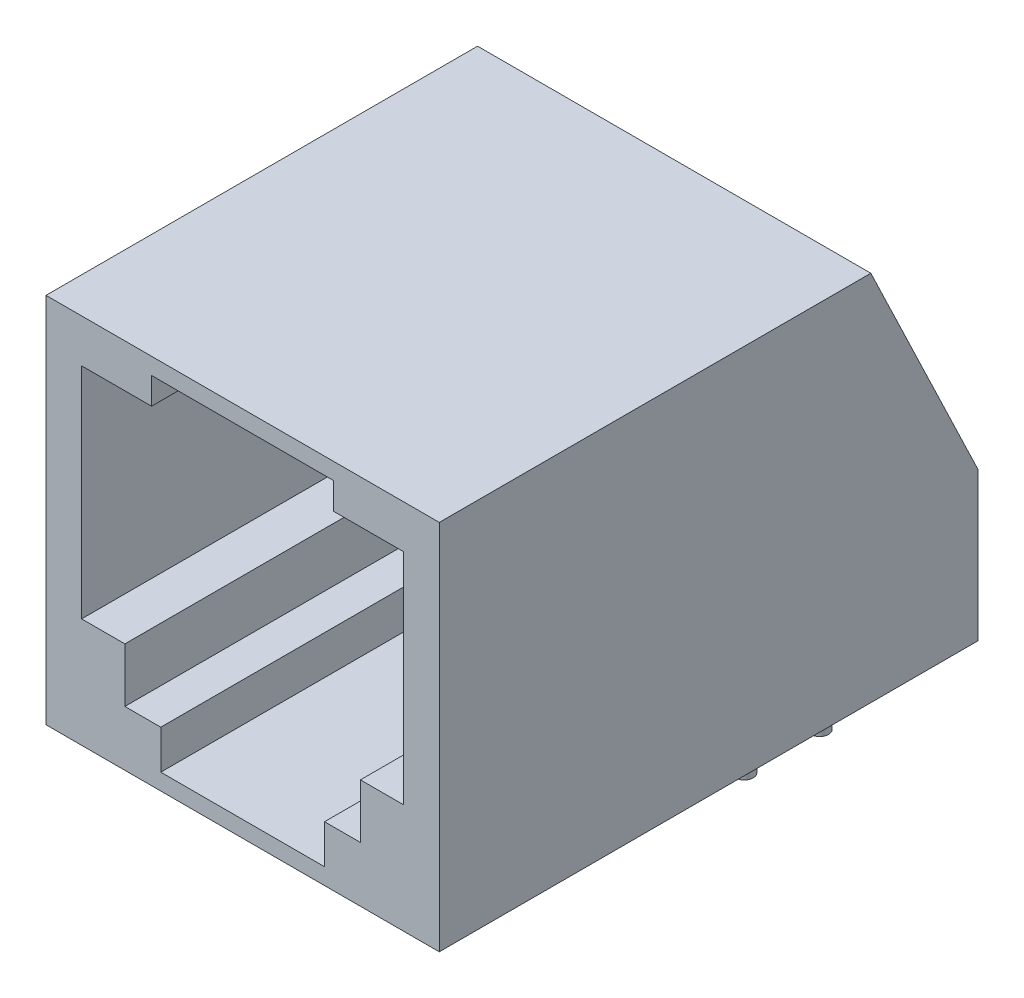
ISO-10303-21;
HEADER;
FILE_DESCRIPTION(('STEP AP214'),'2;1');
FILE_NAME('part.step','',(''),(''),'','','');
FILE_SCHEMA(('AUTOMOTIVE_DESIGN { 1 0 10303 214 1 1 1 1 }'));
ENDSEC;
DATA;
#1=APPLICATION_CONTEXT('core data for automotive mechanical design processes');
#2=APPLICATION_PROTOCOL_DEFINITION('international standard','automotive_design',2000,#1);
#3=PRODUCT_CONTEXT('',#1,'mechanical');
#4=PRODUCT('Part','Part','',(#3));
#5=PRODUCT_RELATED_PRODUCT_CATEGORY('part','',(#4));
#6=PRODUCT_DEFINITION_FORMATION('','',#4);
#7=PRODUCT_DEFINITION_CONTEXT('part definition',#1,'design');
#8=PRODUCT_DEFINITION('design','',#6,#7);
#9=PRODUCT_DEFINITION_SHAPE('','',#8);
#10=(LENGTH_UNIT() NAMED_UNIT(*) SI_UNIT(.MILLI.,.METRE.));
#11=(NAMED_UNIT(*) PLANE_ANGLE_UNIT() SI_UNIT($,.RADIAN.));
#12=(NAMED_UNIT(*) SI_UNIT($,.STERADIAN.) SOLID_ANGLE_UNIT());
#13=UNCERTAINTY_MEASURE_WITH_UNIT(LENGTH_MEASURE(1.E-05),#10,'distance_accuracy_value','');
#14=(GEOMETRIC_REPRESENTATION_CONTEXT(3) GLOBAL_UNCERTAINTY_ASSIGNED_CONTEXT((#13)) GLOBAL_UNIT_ASSIGNED_CONTEXT((#10,
#11,#12)) REPRESENTATION_CONTEXT('',''));
#15=CARTESIAN_POINT('',(0.,0.,0.));
#16=DIRECTION('',(0.,0.,1.));
#17=DIRECTION('',(1.,0.,0.));
#18=AXIS2_PLACEMENT_3D('',#15,#16,#17);
#19=CARTESIAN_POINT('',(6.625,0.,0.));
#20=DIRECTION('',(0.,0.,1.));
#21=DIRECTION('',(1.,0.,0.));
#22=AXIS2_PLACEMENT_3D('',#19,#20,#21);
#23=PLANE('',#22);
#24=DIRECTION('',(0.,-1.,0.));
#25=VECTOR('',#24,1.);
#26=CARTESIAN_POINT('',(-3.06931599732962,11.97,0.));
#27=LINE('',#26,#25);
#28=CARTESIAN_POINT('',(-3.06931599732962,11.97,0.));
#29=VERTEX_POINT('',#28);
#30=CARTESIAN_POINT('',(-3.06931599732962,11.0732094920769,0.));
#31=VERTEX_POINT('',#30);
#32=EDGE_CURVE('E48',#29,#31,#27,.T.);
#33=ORIENTED_EDGE('',*,*,#32,.F.);
#34=DIRECTION('',(1.,0.,0.));
#35=VECTOR('',#34,1.);
#36=CARTESIAN_POINT('',(-3.06931599732962,11.97,0.));
#37=LINE('',#36,#35);
#38=CARTESIAN_POINT('',(3.06931599732962,11.97,0.));
#39=VERTEX_POINT('',#38);
#40=EDGE_CURVE('E320',#29,#39,#37,.T.);
#41=ORIENTED_EDGE('',*,*,#40,.T.);
#42=DIRECTION('',(0.,-1.,0.));
#43=VECTOR('',#42,1.);
#44=CARTESIAN_POINT('',(3.06931599732962,11.97,0.));
#45=LINE('',#44,#43);
#46=CARTESIAN_POINT('',(3.06931599732962,11.0732094920769,0.));
#47=VERTEX_POINT('',#46);
#48=EDGE_CURVE('E406',#39,#47,#45,.T.);
#49=ORIENTED_EDGE('',*,*,#48,.T.);
#50=DIRECTION('',(1.,0.,0.));
#51=VECTOR('',#50,1.);
#52=CARTESIAN_POINT('',(3.06931599732962,11.0732094920769,0.));
#53=LINE('',#52,#51);
#54=CARTESIAN_POINT('',(5.425,11.0732094920769,0.));
#55=VERTEX_POINT('',#54);
#56=EDGE_CURVE('E403',#47,#55,#53,.T.);
#57=ORIENTED_EDGE('',*,*,#56,.T.);
#58=DIRECTION('',(0.,-1.,0.));
#59=VECTOR('',#58,1.);
#60=CARTESIAN_POINT('',(5.425,11.0732094920769,0.));
#61=LINE('',#60,#59);
#62=CARTESIAN_POINT('',(5.425,3.68924953145161,0.));
#63=VERTEX_POINT('',#62);
#64=EDGE_CURVE('E400',#55,#63,#61,.T.);
#65=ORIENTED_EDGE('',*,*,#64,.T.);
#66=DIRECTION('',(-1.,0.,0.));
#67=VECTOR('',#66,1.);
#68=CARTESIAN_POINT('',(5.425,3.68924953145161,0.));
#69=LINE('',#68,#67);
#70=CARTESIAN_POINT('',(3.96769772212622,3.68924953145161,0.));
#71=VERTEX_POINT('',#70);
#72=EDGE_CURVE('E397',#63,#71,#69,.T.);
#73=ORIENTED_EDGE('',*,*,#72,.T.);
#74=DIRECTION('',(0.,-1.,0.));
#75=VECTOR('',#74,1.);
#76=CARTESIAN_POINT('',(3.96769772212622,3.68924953145161,0.));
#77=LINE('',#76,#75);
#78=CARTESIAN_POINT('',(3.96769772212622,1.86326847670819,0.));
#79=VERTEX_POINT('',#78);
#80=EDGE_CURVE('E394',#71,#79,#77,.T.);
#81=ORIENTED_EDGE('',*,*,#80,.T.);
#82=DIRECTION('',(-1.,0.,0.));
#83=VECTOR('',#82,1.);
#84=CARTESIAN_POINT('',(3.96769772212622,1.86326847670819,0.));
#85=LINE('',#84,#83);
#86=CARTESIAN_POINT('',(2.75841266184855,1.86326847670819,0.));
#87=VERTEX_POINT('',#86);
#88=EDGE_CURVE('E391',#79,#87,#85,.T.);
#89=ORIENTED_EDGE('',*,*,#88,.T.);
#90=DIRECTION('',(0.,-1.,0.));
#91=VECTOR('',#90,1.);
#92=CARTESIAN_POINT('',(2.75841266184855,1.86326847670819,0.));
#93=LINE('',#92,#91);
#94=CARTESIAN_POINT('',(2.75841266184855,0.55,0.));
#95=VERTEX_POINT('',#94);
#96=EDGE_CURVE('E388',#87,#95,#93,.T.);
#97=ORIENTED_EDGE('',*,*,#96,.T.);
#98=DIRECTION('',(-1.,0.,0.));
#99=VECTOR('',#98,1.);
#100=CARTESIAN_POINT('',(2.75841266184855,0.55,0.));
#101=LINE('',#100,#99);
#102=CARTESIAN_POINT('',(-2.75841266184855,0.55,0.));
#103=VERTEX_POINT('',#102);
#104=EDGE_CURVE('E385',#95,#103,#101,.T.);
#105=ORIENTED_EDGE('',*,*,#104,.T.);
#106=DIRECTION('',(0.,-1.,0.));
#107=VECTOR('',#106,1.);
#108=CARTESIAN_POINT('',(-2.75841266184855,1.86326847670819,0.));
#109=LINE('',#108,#107);
#110=CARTESIAN_POINT('',(-2.75841266184855,1.86326847670819,0.));
#111=VERTEX_POINT('',#110);
#112=EDGE_CURVE('E382',#111,#103,#109,.T.);
#113=ORIENTED_EDGE('',*,*,#112,.F.);
#114=DIRECTION('',(1.,0.,0.));
#115=VECTOR('',#114,1.);
#116=CARTESIAN_POINT('',(-3.96769772212622,1.86326847670819,0.));
#117=LINE('',#116,#115);
#118=CARTESIAN_POINT('',(-3.96769772212622,1.86326847670819,0.));
#119=VERTEX_POINT('',#118);
#120=EDGE_CURVE('E379',#119,#111,#117,.T.);
#121=ORIENTED_EDGE('',*,*,#120,.F.);
#122=DIRECTION('',(0.,-1.,0.));
#123=VECTOR('',#122,1.);
#124=CARTESIAN_POINT('',(-3.96769772212622,3.68924953145161,0.));
#125=LINE('',#124,#123);
#126=CARTESIAN_POINT('',(-3.96769772212622,3.68924953145161,0.));
#127=VERTEX_POINT('',#126);
#128=EDGE_CURVE('E376',#127,#119,#125,.T.);
#129=ORIENTED_EDGE('',*,*,#128,.F.);
#130=DIRECTION('',(1.,0.,0.));
#131=VECTOR('',#130,1.);
#132=CARTESIAN_POINT('',(-5.425,3.68924953145161,0.));
#133=LINE('',#132,#131);
#134=CARTESIAN_POINT('',(-5.425,3.68924953145161,0.));
#135=VERTEX_POINT('',#134);
#136=EDGE_CURVE('E373',#135,#127,#133,.T.);
#137=ORIENTED_EDGE('',*,*,#136,.F.);
#138=DIRECTION('',(0.,-1.,0.));
#139=VECTOR('',#138,1.);
#140=CARTESIAN_POINT('',(-5.425,11.0732094920769,0.));
#141=LINE('',#140,#139);
#142=CARTESIAN_POINT('',(-5.425,11.0732094920769,0.));
#143=VERTEX_POINT('',#142);
#144=EDGE_CURVE('E370',#143,#135,#141,.T.);
#145=ORIENTED_EDGE('',*,*,#144,.F.);
#146=DIRECTION('',(-1.,0.,0.));
#147=VECTOR('',#146,1.);
#148=CARTESIAN_POINT('',(-3.06931599732962,11.0732094920769,0.));
#149=LINE('',#148,#147);
#150=EDGE_CURVE('E367',#31,#143,#149,.T.);
#151=ORIENTED_EDGE('',*,*,#150,.F.);
#152=EDGE_LOOP('',(#33,#41,#49,#57,#65,#73,#81,#89,#97,#105,#113,#121,#129,#137,#145,#151));
#153=FACE_BOUND('',#152,.T.);
#154=DIRECTION('',(0.,1.,0.));
#155=VECTOR('',#154,1.);
#156=CARTESIAN_POINT('',(-6.625,0.,0.));
#157=LINE('',#156,#155);
#158=CARTESIAN_POINT('',(-6.625,0.,0.));
#159=VERTEX_POINT('',#158);
#160=CARTESIAN_POINT('',(-6.625,12.53,0.));
#161=VERTEX_POINT('',#160);
#162=EDGE_CURVE('E122',#159,#161,#157,.T.);
#163=ORIENTED_EDGE('',*,*,#162,.F.);
#164=DIRECTION('',(-1.,0.,0.));
#165=VECTOR('',#164,1.);
#166=CARTESIAN_POINT('',(6.625,0.,0.));
#167=LINE('',#166,#165);
#168=CARTESIAN_POINT('',(6.625,0.,0.));
#169=VERTEX_POINT('',#168);
#170=EDGE_CURVE('E11',#169,#159,#167,.T.);
#171=ORIENTED_EDGE('',*,*,#170,.F.);
#172=DIRECTION('',(0.,1.,0.));
#173=VECTOR('',#172,1.);
#174=CARTESIAN_POINT('',(6.625,0.,0.));
#175=LINE('',#174,#173);
#176=CARTESIAN_POINT('',(6.625,12.53,0.));
#177=VERTEX_POINT('',#176);
#178=EDGE_CURVE('E117',#169,#177,#175,.T.);
#179=ORIENTED_EDGE('',*,*,#178,.T.);
#180=DIRECTION('',(-1.,0.,0.));
#181=VECTOR('',#180,1.);
#182=CARTESIAN_POINT('',(6.625,12.53,0.));
#183=LINE('',#182,#181);
#184=EDGE_CURVE('E35',#177,#161,#183,.T.);
#185=ORIENTED_EDGE('',*,*,#184,.T.);
#186=EDGE_LOOP('',(#163,#171,#179,#185));
#187=FACE_BOUND('',#186,.T.);
#188=ADVANCED_FACE('F32',(#153,#187),#23,.T.);
#189=CARTESIAN_POINT('',(6.625,0.,-18.15));
#190=DIRECTION('',(0.,-1.,0.));
#191=DIRECTION('',(0.,0.,-1.));
#192=AXIS2_PLACEMENT_3D('',#189,#190,#191);
#193=PLANE('',#192);
#194=CARTESIAN_POINT('',(2.54,0.,-14.36));
#195=DIRECTION('',(0.,-1.,0.));
#196=DIRECTION('',(0.,0.,-1.));
#197=AXIS2_PLACEMENT_3D('',#194,#195,#196);
#198=CIRCLE('',#197,0.3);
#199=CARTESIAN_POINT('',(2.54,0.,-14.66));
#200=VERTEX_POINT('',#199);
#201=EDGE_CURVE('E282',#200,#200,#198,.T.);
#202=ORIENTED_EDGE('',*,*,#201,.F.);
#203=EDGE_LOOP('',(#202));
#204=FACE_BOUND('',#203,.T.);
#205=CARTESIAN_POINT('',(-2.54,0.,-14.36));
#206=DIRECTION('',(0.,-1.,0.));
#207=DIRECTION('',(0.,0.,-1.));
#208=AXIS2_PLACEMENT_3D('',#205,#206,#207);
#209=CIRCLE('',#208,0.3);
#210=CARTESIAN_POINT('',(-2.54,0.,-14.66));
#211=VERTEX_POINT('',#210);
#212=EDGE_CURVE('E281',#211,#211,#209,.T.);
#213=ORIENTED_EDGE('',*,*,#212,.F.);
#214=EDGE_LOOP('',(#213));
#215=FACE_BOUND('',#214,.T.);
#216=CARTESIAN_POINT('',(0.,0.,-14.3600000000001));
#217=DIRECTION('',(0.,-1.,0.));
#218=DIRECTION('',(0.,0.,-1.));
#219=AXIS2_PLACEMENT_3D('',#216,#217,#218);
#220=CIRCLE('',#219,0.3);
#221=CARTESIAN_POINT('',(0.,0.,-14.6600000000001));
#222=VERTEX_POINT('',#221);
#223=EDGE_CURVE('E291',#222,#222,#220,.T.);
#224=ORIENTED_EDGE('',*,*,#223,.F.);
#225=EDGE_LOOP('',(#224));
#226=FACE_BOUND('',#225,.T.);
#227=CARTESIAN_POINT('',(-2.54,0.,-16.9));
#228=DIRECTION('',(0.,-1.,0.));
#229=DIRECTION('',(0.,0.,-1.));
#230=AXIS2_PLACEMENT_3D('',#227,#228,#229);
#231=CIRCLE('',#230,0.300000000000002);
#232=CARTESIAN_POINT('',(-2.54,0.,-17.2));
#233=VERTEX_POINT('',#232);
#234=EDGE_CURVE('E296',#233,#233,#231,.T.);
#235=ORIENTED_EDGE('',*,*,#234,.F.);
#236=EDGE_LOOP('',(#235));
#237=FACE_BOUND('',#236,.T.);
#238=CARTESIAN_POINT('',(0.,0.,-16.9));
#239=DIRECTION('',(0.,-1.,0.));
#240=DIRECTION('',(0.,0.,-1.));
#241=AXIS2_PLACEMENT_3D('',#238,#239,#240);
#242=CIRCLE('',#241,0.3);
#243=CARTESIAN_POINT('',(0.,0.,-17.2));
#244=VERTEX_POINT('',#243);
#245=EDGE_CURVE('E302',#244,#244,#242,.T.);
#246=ORIENTED_EDGE('',*,*,#245,.F.);
#247=EDGE_LOOP('',(#246));
#248=FACE_BOUND('',#247,.T.);
#249=CARTESIAN_POINT('',(2.54,0.,-16.9));
#250=DIRECTION('',(0.,-1.,0.));
#251=DIRECTION('',(0.,0.,-1.));
#252=AXIS2_PLACEMENT_3D('',#249,#250,#251);
#253=CIRCLE('',#252,0.300000000000002);
#254=CARTESIAN_POINT('',(2.54,0.,-17.2));
#255=VERTEX_POINT('',#254);
#256=EDGE_CURVE('E308',#255,#255,#253,.T.);
#257=ORIENTED_EDGE('',*,*,#256,.F.);
#258=EDGE_LOOP('',(#257));
#259=FACE_BOUND('',#258,.T.);
#260=DIRECTION('',(0.,0.,1.));
#261=VECTOR('',#260,1.);
#262=CARTESIAN_POINT('',(-6.625,0.,-18.15));
#263=LINE('',#262,#261);
#264=CARTESIAN_POINT('',(-6.625,0.,-18.15));
#265=VERTEX_POINT('',#264);
#266=EDGE_CURVE('E132',#265,#159,#263,.T.);
#267=ORIENTED_EDGE('',*,*,#266,.F.);
#268=DIRECTION('',(-1.,0.,0.));
#269=VECTOR('',#268,1.);
#270=CARTESIAN_POINT('',(6.625,0.,-18.15));
#271=LINE('',#270,#269);
#272=CARTESIAN_POINT('',(6.625,0.,-18.15));
#273=VERTEX_POINT('',#272);
#274=EDGE_CURVE('E40',#273,#265,#271,.T.);
#275=ORIENTED_EDGE('',*,*,#274,.F.);
#276=DIRECTION('',(0.,0.,1.));
#277=VECTOR('',#276,1.);
#278=CARTESIAN_POINT('',(6.625,0.,-18.15));
#279=LINE('',#278,#277);
#280=EDGE_CURVE('E112',#273,#169,#279,.T.);
#281=ORIENTED_EDGE('',*,*,#280,.T.);
#282=ORIENTED_EDGE('',*,*,#170,.T.);
#283=EDGE_LOOP('',(#267,#275,#281,#282));
#284=FACE_BOUND('',#283,.T.);
#285=ADVANCED_FACE('F138',(#204,#215,#226,#237,#248,#259,#284),#193,.T.);
#286=CARTESIAN_POINT('',(6.625,5.,-18.15));
#287=DIRECTION('',(0.,0.,-1.));
#288=DIRECTION('',(-1.,0.,0.));
#289=AXIS2_PLACEMENT_3D('',#286,#287,#288);
#290=PLANE('',#289);
#291=DIRECTION('',(0.,-1.,0.));
#292=VECTOR('',#291,1.);
#293=CARTESIAN_POINT('',(-6.625,5.,-18.15));
#294=LINE('',#293,#292);
#295=CARTESIAN_POINT('',(-6.625,5.,-18.15));
#296=VERTEX_POINT('',#295);
#297=EDGE_CURVE('E101',#296,#265,#294,.T.);
#298=ORIENTED_EDGE('',*,*,#297,.F.);
#299=DIRECTION('',(-1.,0.,0.));
#300=VECTOR('',#299,1.);
#301=CARTESIAN_POINT('',(6.625,5.,-18.15));
#302=LINE('',#301,#300);
#303=CARTESIAN_POINT('',(6.625,5.,-18.15));
#304=VERTEX_POINT('',#303);
#305=EDGE_CURVE('E95',#304,#296,#302,.T.);
#306=ORIENTED_EDGE('',*,*,#305,.F.);
#307=DIRECTION('',(0.,-1.,0.));
#308=VECTOR('',#307,1.);
#309=CARTESIAN_POINT('',(6.625,5.,-18.15));
#310=LINE('',#309,#308);
#311=EDGE_CURVE('E98',#304,#273,#310,.T.);
#312=ORIENTED_EDGE('',*,*,#311,.T.);
#313=ORIENTED_EDGE('',*,*,#274,.T.);
#314=EDGE_LOOP('',(#298,#306,#312,#313));
#315=FACE_BOUND('',#314,.T.);
#316=ADVANCED_FACE('F97',(#315),#290,.T.);
#317=CARTESIAN_POINT('',(6.625,12.53,-14.54));
#318=DIRECTION('',(0.,0.432302778813914,-0.901728510933179));
#319=DIRECTION('',(0.,0.901728510933179,0.432302778813914));
#320=AXIS2_PLACEMENT_3D('',#317,#318,#319);
#321=PLANE('',#320);
#322=DIRECTION('',(0.,-0.901728510933179,-0.432302778813914));
#323=VECTOR('',#322,1.);
#324=CARTESIAN_POINT('',(-6.625,12.53,-14.54));
#325=LINE('',#324,#323);
#326=CARTESIAN_POINT('',(-6.625,12.53,-14.54));
#327=VERTEX_POINT('',#326);
#328=EDGE_CURVE('E129',#327,#296,#325,.T.);
#329=ORIENTED_EDGE('',*,*,#328,.F.);
#330=DIRECTION('',(-1.,0.,0.));
#331=VECTOR('',#330,1.);
#332=CARTESIAN_POINT('',(6.625,12.53,-14.54));
#333=LINE('',#332,#331);
#334=CARTESIAN_POINT('',(6.625,12.53,-14.54));
#335=VERTEX_POINT('',#334);
#336=EDGE_CURVE('E106',#335,#327,#333,.T.);
#337=ORIENTED_EDGE('',*,*,#336,.F.);
#338=DIRECTION('',(0.,-0.901728510933179,-0.432302778813914));
#339=VECTOR('',#338,1.);
#340=CARTESIAN_POINT('',(6.625,12.53,-14.54));
#341=LINE('',#340,#339);
#342=EDGE_CURVE('E111',#335,#304,#341,.T.);
#343=ORIENTED_EDGE('',*,*,#342,.T.);
#344=ORIENTED_EDGE('',*,*,#305,.T.);
#345=EDGE_LOOP('',(#329,#337,#343,#344));
#346=FACE_BOUND('',#345,.T.);
#347=ADVANCED_FACE('F114',(#346),#321,.T.);
#348=CARTESIAN_POINT('',(6.625,12.53,0.));
#349=DIRECTION('',(0.,1.,0.));
#350=DIRECTION('',(0.,0.,1.));
#351=AXIS2_PLACEMENT_3D('',#348,#349,#350);
#352=PLANE('',#351);
#353=DIRECTION('',(0.,0.,-1.));
#354=VECTOR('',#353,1.);
#355=CARTESIAN_POINT('',(-6.625,12.53,0.));
#356=LINE('',#355,#354);
#357=EDGE_CURVE('E125',#161,#327,#356,.T.);
#358=ORIENTED_EDGE('',*,*,#357,.F.);
#359=ORIENTED_EDGE('',*,*,#184,.F.);
#360=DIRECTION('',(0.,0.,-1.));
#361=VECTOR('',#360,1.);
#362=CARTESIAN_POINT('',(6.625,12.53,0.));
#363=LINE('',#362,#361);
#364=EDGE_CURVE('E115',#177,#335,#363,.T.);
#365=ORIENTED_EDGE('',*,*,#364,.T.);
#366=ORIENTED_EDGE('',*,*,#336,.T.);
#367=EDGE_LOOP('',(#358,#359,#365,#366));
#368=FACE_BOUND('',#367,.T.);
#369=ADVANCED_FACE('F135',(#368),#352,.T.);
#370=CARTESIAN_POINT('',(6.625,0.,0.));
#371=DIRECTION('',(-1.,0.,0.));
#372=DIRECTION('',(0.,0.,1.));
#373=AXIS2_PLACEMENT_3D('',#370,#371,#372);
#374=PLANE('',#373);
#375=ORIENTED_EDGE('',*,*,#178,.F.);
#376=ORIENTED_EDGE('',*,*,#280,.F.);
#377=ORIENTED_EDGE('',*,*,#311,.F.);
#378=ORIENTED_EDGE('',*,*,#342,.F.);
#379=ORIENTED_EDGE('',*,*,#364,.F.);
#380=EDGE_LOOP('',(#375,#376,#377,#378,#379));
#381=FACE_BOUND('',#380,.T.);
#382=ADVANCED_FACE('F110',(#381),#374,.F.);
#383=CARTESIAN_POINT('',(-6.625,0.,0.));
#384=DIRECTION('',(-1.,0.,0.));
#385=DIRECTION('',(0.,0.,1.));
#386=AXIS2_PLACEMENT_3D('',#383,#384,#385);
#387=PLANE('',#386);
#388=ORIENTED_EDGE('',*,*,#162,.T.);
#389=ORIENTED_EDGE('',*,*,#357,.T.);
#390=ORIENTED_EDGE('',*,*,#328,.T.);
#391=ORIENTED_EDGE('',*,*,#297,.T.);
#392=ORIENTED_EDGE('',*,*,#266,.T.);
#393=EDGE_LOOP('',(#388,#389,#390,#391,#392));
#394=FACE_BOUND('',#393,.T.);
#395=ADVANCED_FACE('F137',(#394),#387,.T.);
#396=CARTESIAN_POINT('',(-3.06931599732962,11.97,-13.25));
#397=DIRECTION('',(-1.,0.,0.));
#398=DIRECTION('',(0.,0.,1.));
#399=AXIS2_PLACEMENT_3D('',#396,#397,#398);
#400=PLANE('',#399);
#401=ORIENTED_EDGE('',*,*,#32,.T.);
#402=DIRECTION('',(0.,0.,1.));
#403=VECTOR('',#402,1.);
#404=CARTESIAN_POINT('',(-3.06931599732962,11.0732094920769,-13.25));
#405=LINE('',#404,#403);
#406=CARTESIAN_POINT('',(-3.06931599732962,11.0732094920769,-13.25));
#407=VERTEX_POINT('',#406);
#408=EDGE_CURVE('E365',#407,#31,#405,.T.);
#409=ORIENTED_EDGE('',*,*,#408,.F.);
#410=DIRECTION('',(0.,-1.,0.));
#411=VECTOR('',#410,1.);
#412=CARTESIAN_POINT('',(-3.06931599732962,11.97,-13.25));
#413=LINE('',#412,#411);
#414=CARTESIAN_POINT('',(-3.06931599732962,11.97,-13.25));
#415=VERTEX_POINT('',#414);
#416=EDGE_CURVE('E316',#415,#407,#413,.T.);
#417=ORIENTED_EDGE('',*,*,#416,.F.);
#418=DIRECTION('',(0.,0.,1.));
#419=VECTOR('',#418,1.);
#420=CARTESIAN_POINT('',(-3.06931599732962,11.97,-13.25));
#421=LINE('',#420,#419);
#422=EDGE_CURVE('E126',#415,#29,#421,.T.);
#423=ORIENTED_EDGE('',*,*,#422,.T.);
#424=EDGE_LOOP('',(#401,#409,#417,#423));
#425=FACE_BOUND('',#424,.T.);
#426=ADVANCED_FACE('F161',(#425),#400,.F.);
#427=CARTESIAN_POINT('',(-3.06931599732962,11.97,-13.25));
#428=DIRECTION('',(0.,-1.,0.));
#429=DIRECTION('',(0.,0.,-1.));
#430=AXIS2_PLACEMENT_3D('',#427,#428,#429);
#431=PLANE('',#430);
#432=ORIENTED_EDGE('',*,*,#40,.F.);
#433=ORIENTED_EDGE('',*,*,#422,.F.);
#434=DIRECTION('',(1.,0.,0.));
#435=VECTOR('',#434,1.);
#436=CARTESIAN_POINT('',(-3.06931599732962,11.97,-13.25));
#437=LINE('',#436,#435);
#438=CARTESIAN_POINT('',(3.06931599732962,11.97,-13.25));
#439=VERTEX_POINT('',#438);
#440=EDGE_CURVE('E362',#415,#439,#437,.T.);
#441=ORIENTED_EDGE('',*,*,#440,.T.);
#442=DIRECTION('',(0.,0.,1.));
#443=VECTOR('',#442,1.);
#444=CARTESIAN_POINT('',(3.06931599732962,11.97,-13.25));
#445=LINE('',#444,#443);
#446=EDGE_CURVE('E412',#439,#39,#445,.T.);
#447=ORIENTED_EDGE('',*,*,#446,.T.);
#448=EDGE_LOOP('',(#432,#433,#441,#447));
#449=FACE_BOUND('',#448,.T.);
#450=ADVANCED_FACE('F165',(#449),#431,.T.);
#451=CARTESIAN_POINT('',(3.06931599732962,11.97,-13.25));
#452=DIRECTION('',(-1.,0.,0.));
#453=DIRECTION('',(0.,0.,1.));
#454=AXIS2_PLACEMENT_3D('',#451,#452,#453);
#455=PLANE('',#454);
#456=ORIENTED_EDGE('',*,*,#48,.F.);
#457=ORIENTED_EDGE('',*,*,#446,.F.);
#458=DIRECTION('',(0.,-1.,0.));
#459=VECTOR('',#458,1.);
#460=CARTESIAN_POINT('',(3.06931599732962,11.97,-13.25));
#461=LINE('',#460,#459);
#462=CARTESIAN_POINT('',(3.06931599732962,11.0732094920769,-13.25));
#463=VERTEX_POINT('',#462);
#464=EDGE_CURVE('E359',#439,#463,#461,.T.);
#465=ORIENTED_EDGE('',*,*,#464,.T.);
#466=DIRECTION('',(0.,0.,1.));
#467=VECTOR('',#466,1.);
#468=CARTESIAN_POINT('',(3.06931599732962,11.0732094920769,-13.25));
#469=LINE('',#468,#467);
#470=EDGE_CURVE('E415',#463,#47,#469,.T.);
#471=ORIENTED_EDGE('',*,*,#470,.T.);
#472=EDGE_LOOP('',(#456,#457,#465,#471));
#473=FACE_BOUND('',#472,.T.);
#474=ADVANCED_FACE('F218',(#473),#455,.T.);
#475=CARTESIAN_POINT('',(3.06931599732962,11.0732094920769,-13.25));
#476=DIRECTION('',(0.,-1.,0.));
#477=DIRECTION('',(0.,0.,-1.));
#478=AXIS2_PLACEMENT_3D('',#475,#476,#477);
#479=PLANE('',#478);
#480=ORIENTED_EDGE('',*,*,#56,.F.);
#481=ORIENTED_EDGE('',*,*,#470,.F.);
#482=DIRECTION('',(1.,0.,0.));
#483=VECTOR('',#482,1.);
#484=CARTESIAN_POINT('',(3.06931599732962,11.0732094920769,-13.25));
#485=LINE('',#484,#483);
#486=CARTESIAN_POINT('',(5.425,11.0732094920769,-13.25));
#487=VERTEX_POINT('',#486);
#488=EDGE_CURVE('E356',#463,#487,#485,.T.);
#489=ORIENTED_EDGE('',*,*,#488,.T.);
#490=DIRECTION('',(0.,0.,1.));
#491=VECTOR('',#490,1.);
#492=CARTESIAN_POINT('',(5.425,11.0732094920769,-13.25));
#493=LINE('',#492,#491);
#494=EDGE_CURVE('E418',#487,#55,#493,.T.);
#495=ORIENTED_EDGE('',*,*,#494,.T.);
#496=EDGE_LOOP('',(#480,#481,#489,#495));
#497=FACE_BOUND('',#496,.T.);
#498=ADVANCED_FACE('F214',(#497),#479,.T.);
#499=CARTESIAN_POINT('',(5.425,11.0732094920769,-13.25));
#500=DIRECTION('',(-1.,0.,0.));
#501=DIRECTION('',(0.,-1.,0.));
#502=AXIS2_PLACEMENT_3D('',#499,#500,#501);
#503=PLANE('',#502);
#504=ORIENTED_EDGE('',*,*,#64,.F.);
#505=ORIENTED_EDGE('',*,*,#494,.F.);
#506=DIRECTION('',(0.,-1.,0.));
#507=VECTOR('',#506,1.);
#508=CARTESIAN_POINT('',(5.425,11.0732094920769,-13.25));
#509=LINE('',#508,#507);
#510=CARTESIAN_POINT('',(5.425,3.68924953145161,-13.25));
#511=VERTEX_POINT('',#510);
#512=EDGE_CURVE('E353',#487,#511,#509,.T.);
#513=ORIENTED_EDGE('',*,*,#512,.T.);
#514=DIRECTION('',(0.,0.,1.));
#515=VECTOR('',#514,1.);
#516=CARTESIAN_POINT('',(5.425,3.68924953145161,-13.25));
#517=LINE('',#516,#515);
#518=EDGE_CURVE('E421',#511,#63,#517,.T.);
#519=ORIENTED_EDGE('',*,*,#518,.T.);
#520=EDGE_LOOP('',(#504,#505,#513,#519));
#521=FACE_BOUND('',#520,.T.);
#522=ADVANCED_FACE('F210',(#521),#503,.T.);
#523=CARTESIAN_POINT('',(5.425,3.68924953145161,-13.25));
#524=DIRECTION('',(0.,1.,0.));
#525=DIRECTION('',(-1.,0.,0.));
#526=AXIS2_PLACEMENT_3D('',#523,#524,#525);
#527=PLANE('',#526);
#528=ORIENTED_EDGE('',*,*,#72,.F.);
#529=ORIENTED_EDGE('',*,*,#518,.F.);
#530=DIRECTION('',(-1.,0.,0.));
#531=VECTOR('',#530,1.);
#532=CARTESIAN_POINT('',(5.425,3.68924953145161,-13.25));
#533=LINE('',#532,#531);
#534=CARTESIAN_POINT('',(3.96769772212622,3.68924953145161,-13.25));
#535=VERTEX_POINT('',#534);
#536=EDGE_CURVE('E350',#511,#535,#533,.T.);
#537=ORIENTED_EDGE('',*,*,#536,.T.);
#538=DIRECTION('',(0.,0.,1.));
#539=VECTOR('',#538,1.);
#540=CARTESIAN_POINT('',(3.96769772212622,3.68924953145161,-13.25));
#541=LINE('',#540,#539);
#542=EDGE_CURVE('E424',#535,#71,#541,.T.);
#543=ORIENTED_EDGE('',*,*,#542,.T.);
#544=EDGE_LOOP('',(#528,#529,#537,#543));
#545=FACE_BOUND('',#544,.T.);
#546=ADVANCED_FACE('F206',(#545),#527,.T.);
#547=CARTESIAN_POINT('',(3.96769772212622,3.68924953145161,-13.25));
#548=DIRECTION('',(-1.,0.,0.));
#549=DIRECTION('',(0.,0.,1.));
#550=AXIS2_PLACEMENT_3D('',#547,#548,#549);
#551=PLANE('',#550);
#552=ORIENTED_EDGE('',*,*,#80,.F.);
#553=ORIENTED_EDGE('',*,*,#542,.F.);
#554=DIRECTION('',(0.,-1.,0.));
#555=VECTOR('',#554,1.);
#556=CARTESIAN_POINT('',(3.96769772212622,3.68924953145161,-13.25));
#557=LINE('',#556,#555);
#558=CARTESIAN_POINT('',(3.96769772212622,1.86326847670819,-13.25));
#559=VERTEX_POINT('',#558);
#560=EDGE_CURVE('E347',#535,#559,#557,.T.);
#561=ORIENTED_EDGE('',*,*,#560,.T.);
#562=DIRECTION('',(0.,0.,1.));
#563=VECTOR('',#562,1.);
#564=CARTESIAN_POINT('',(3.96769772212622,1.86326847670819,-13.25));
#565=LINE('',#564,#563);
#566=EDGE_CURVE('E427',#559,#79,#565,.T.);
#567=ORIENTED_EDGE('',*,*,#566,.T.);
#568=EDGE_LOOP('',(#552,#553,#561,#567));
#569=FACE_BOUND('',#568,.T.);
#570=ADVANCED_FACE('F202',(#569),#551,.T.);
#571=CARTESIAN_POINT('',(3.96769772212622,1.86326847670819,-13.25));
#572=DIRECTION('',(0.,1.,0.));
#573=DIRECTION('',(-1.,0.,0.));
#574=AXIS2_PLACEMENT_3D('',#571,#572,#573);
#575=PLANE('',#574);
#576=ORIENTED_EDGE('',*,*,#88,.F.);
#577=ORIENTED_EDGE('',*,*,#566,.F.);
#578=DIRECTION('',(-1.,0.,0.));
#579=VECTOR('',#578,1.);
#580=CARTESIAN_POINT('',(3.96769772212622,1.86326847670819,-13.25));
#581=LINE('',#580,#579);
#582=CARTESIAN_POINT('',(2.75841266184855,1.86326847670819,-13.25));
#583=VERTEX_POINT('',#582);
#584=EDGE_CURVE('E344',#559,#583,#581,.T.);
#585=ORIENTED_EDGE('',*,*,#584,.T.);
#586=DIRECTION('',(0.,0.,1.));
#587=VECTOR('',#586,1.);
#588=CARTESIAN_POINT('',(2.75841266184855,1.86326847670819,-13.25));
#589=LINE('',#588,#587);
#590=EDGE_CURVE('E430',#583,#87,#589,.T.);
#591=ORIENTED_EDGE('',*,*,#590,.T.);
#592=EDGE_LOOP('',(#576,#577,#585,#591));
#593=FACE_BOUND('',#592,.T.);
#594=ADVANCED_FACE('F198',(#593),#575,.T.);
#595=CARTESIAN_POINT('',(2.75841266184855,1.86326847670819,-13.25));
#596=DIRECTION('',(-1.,0.,0.));
#597=DIRECTION('',(0.,-1.,0.));
#598=AXIS2_PLACEMENT_3D('',#595,#596,#597);
#599=PLANE('',#598);
#600=ORIENTED_EDGE('',*,*,#96,.F.);
#601=ORIENTED_EDGE('',*,*,#590,.F.);
#602=DIRECTION('',(0.,-1.,0.));
#603=VECTOR('',#602,1.);
#604=CARTESIAN_POINT('',(2.75841266184855,1.86326847670819,-13.25));
#605=LINE('',#604,#603);
#606=CARTESIAN_POINT('',(2.75841266184855,0.55,-13.25));
#607=VERTEX_POINT('',#606);
#608=EDGE_CURVE('E341',#583,#607,#605,.T.);
#609=ORIENTED_EDGE('',*,*,#608,.T.);
#610=DIRECTION('',(0.,0.,1.));
#611=VECTOR('',#610,1.);
#612=CARTESIAN_POINT('',(2.75841266184855,0.55,-13.25));
#613=LINE('',#612,#611);
#614=EDGE_CURVE('E433',#607,#95,#613,.T.);
#615=ORIENTED_EDGE('',*,*,#614,.T.);
#616=EDGE_LOOP('',(#600,#601,#609,#615));
#617=FACE_BOUND('',#616,.T.);
#618=ADVANCED_FACE('F194',(#617),#599,.T.);
#619=CARTESIAN_POINT('',(2.75841266184855,0.55,-13.25));
#620=DIRECTION('',(0.,1.,0.));
#621=DIRECTION('',(0.,0.,1.));
#622=AXIS2_PLACEMENT_3D('',#619,#620,#621);
#623=PLANE('',#622);
#624=ORIENTED_EDGE('',*,*,#104,.F.);
#625=ORIENTED_EDGE('',*,*,#614,.F.);
#626=DIRECTION('',(-1.,0.,0.));
#627=VECTOR('',#626,1.);
#628=CARTESIAN_POINT('',(2.75841266184855,0.55,-13.25));
#629=LINE('',#628,#627);
#630=CARTESIAN_POINT('',(-2.75841266184855,0.55,-13.25));
#631=VERTEX_POINT('',#630);
#632=EDGE_CURVE('E338',#607,#631,#629,.T.);
#633=ORIENTED_EDGE('',*,*,#632,.T.);
#634=DIRECTION('',(0.,0.,1.));
#635=VECTOR('',#634,1.);
#636=CARTESIAN_POINT('',(-2.75841266184855,0.55,-13.25));
#637=LINE('',#636,#635);
#638=EDGE_CURVE('E436',#631,#103,#637,.T.);
#639=ORIENTED_EDGE('',*,*,#638,.T.);
#640=EDGE_LOOP('',(#624,#625,#633,#639));
#641=FACE_BOUND('',#640,.T.);
#642=ADVANCED_FACE('F190',(#641),#623,.T.);
#643=CARTESIAN_POINT('',(-2.75841266184855,1.86326847670819,-13.25));
#644=DIRECTION('',(-1.,0.,0.));
#645=DIRECTION('',(0.,-1.,0.));
#646=AXIS2_PLACEMENT_3D('',#643,#644,#645);
#647=PLANE('',#646);
#648=ORIENTED_EDGE('',*,*,#112,.T.);
#649=ORIENTED_EDGE('',*,*,#638,.F.);
#650=DIRECTION('',(0.,-1.,0.));
#651=VECTOR('',#650,1.);
#652=CARTESIAN_POINT('',(-2.75841266184855,1.86326847670819,-13.25));
#653=LINE('',#652,#651);
#654=CARTESIAN_POINT('',(-2.75841266184855,1.86326847670819,-13.25));
#655=VERTEX_POINT('',#654);
#656=EDGE_CURVE('E335',#655,#631,#653,.T.);
#657=ORIENTED_EDGE('',*,*,#656,.F.);
#658=DIRECTION('',(0.,0.,1.));
#659=VECTOR('',#658,1.);
#660=CARTESIAN_POINT('',(-2.75841266184855,1.86326847670819,-13.25));
#661=LINE('',#660,#659);
#662=EDGE_CURVE('E439',#655,#111,#661,.T.);
#663=ORIENTED_EDGE('',*,*,#662,.T.);
#664=EDGE_LOOP('',(#648,#649,#657,#663));
#665=FACE_BOUND('',#664,.T.);
#666=ADVANCED_FACE('F186',(#665),#647,.F.);
#667=CARTESIAN_POINT('',(-3.96769772212622,1.86326847670819,-13.25));
#668=DIRECTION('',(0.,-1.,0.));
#669=DIRECTION('',(1.,0.,0.));
#670=AXIS2_PLACEMENT_3D('',#667,#668,#669);
#671=PLANE('',#670);
#672=ORIENTED_EDGE('',*,*,#120,.T.);
#673=ORIENTED_EDGE('',*,*,#662,.F.);
#674=DIRECTION('',(1.,0.,0.));
#675=VECTOR('',#674,1.);
#676=CARTESIAN_POINT('',(-3.96769772212622,1.86326847670819,-13.25));
#677=LINE('',#676,#675);
#678=CARTESIAN_POINT('',(-3.96769772212622,1.86326847670819,-13.25));
#679=VERTEX_POINT('',#678);
#680=EDGE_CURVE('E332',#679,#655,#677,.T.);
#681=ORIENTED_EDGE('',*,*,#680,.F.);
#682=DIRECTION('',(0.,0.,1.));
#683=VECTOR('',#682,1.);
#684=CARTESIAN_POINT('',(-3.96769772212622,1.86326847670819,-13.25));
#685=LINE('',#684,#683);
#686=EDGE_CURVE('E442',#679,#119,#685,.T.);
#687=ORIENTED_EDGE('',*,*,#686,.T.);
#688=EDGE_LOOP('',(#672,#673,#681,#687));
#689=FACE_BOUND('',#688,.T.);
#690=ADVANCED_FACE('F182',(#689),#671,.F.);
#691=CARTESIAN_POINT('',(-3.96769772212622,3.68924953145161,-13.25));
#692=DIRECTION('',(-1.,0.,0.));
#693=DIRECTION('',(0.,0.,1.));
#694=AXIS2_PLACEMENT_3D('',#691,#692,#693);
#695=PLANE('',#694);
#696=ORIENTED_EDGE('',*,*,#128,.T.);
#697=ORIENTED_EDGE('',*,*,#686,.F.);
#698=DIRECTION('',(0.,-1.,0.));
#699=VECTOR('',#698,1.);
#700=CARTESIAN_POINT('',(-3.96769772212622,3.68924953145161,-13.25));
#701=LINE('',#700,#699);
#702=CARTESIAN_POINT('',(-3.96769772212622,3.68924953145161,-13.25));
#703=VERTEX_POINT('',#702);
#704=EDGE_CURVE('E329',#703,#679,#701,.T.);
#705=ORIENTED_EDGE('',*,*,#704,.F.);
#706=DIRECTION('',(0.,0.,1.));
#707=VECTOR('',#706,1.);
#708=CARTESIAN_POINT('',(-3.96769772212622,3.68924953145161,-13.25));
#709=LINE('',#708,#707);
#710=EDGE_CURVE('E445',#703,#127,#709,.T.);
#711=ORIENTED_EDGE('',*,*,#710,.T.);
#712=EDGE_LOOP('',(#696,#697,#705,#711));
#713=FACE_BOUND('',#712,.T.);
#714=ADVANCED_FACE('F178',(#713),#695,.F.);
#715=CARTESIAN_POINT('',(-5.425,3.68924953145161,-13.25));
#716=DIRECTION('',(0.,-1.,0.));
#717=DIRECTION('',(1.,0.,0.));
#718=AXIS2_PLACEMENT_3D('',#715,#716,#717);
#719=PLANE('',#718);
#720=ORIENTED_EDGE('',*,*,#136,.T.);
#721=ORIENTED_EDGE('',*,*,#710,.F.);
#722=DIRECTION('',(1.,0.,0.));
#723=VECTOR('',#722,1.);
#724=CARTESIAN_POINT('',(-5.425,3.68924953145161,-13.25));
#725=LINE('',#724,#723);
#726=CARTESIAN_POINT('',(-5.425,3.68924953145161,-13.25));
#727=VERTEX_POINT('',#726);
#728=EDGE_CURVE('E326',#727,#703,#725,.T.);
#729=ORIENTED_EDGE('',*,*,#728,.F.);
#730=DIRECTION('',(0.,0.,1.));
#731=VECTOR('',#730,1.);
#732=CARTESIAN_POINT('',(-5.425,3.68924953145161,-13.25));
#733=LINE('',#732,#731);
#734=EDGE_CURVE('E448',#727,#135,#733,.T.);
#735=ORIENTED_EDGE('',*,*,#734,.T.);
#736=EDGE_LOOP('',(#720,#721,#729,#735));
#737=FACE_BOUND('',#736,.T.);
#738=ADVANCED_FACE('F174',(#737),#719,.F.);
#739=CARTESIAN_POINT('',(-5.425,11.0732094920769,-13.25));
#740=DIRECTION('',(-1.,0.,0.));
#741=DIRECTION('',(0.,-1.,0.));
#742=AXIS2_PLACEMENT_3D('',#739,#740,#741);
#743=PLANE('',#742);
#744=ORIENTED_EDGE('',*,*,#144,.T.);
#745=ORIENTED_EDGE('',*,*,#734,.F.);
#746=DIRECTION('',(0.,-1.,0.));
#747=VECTOR('',#746,1.);
#748=CARTESIAN_POINT('',(-5.425,11.0732094920769,-13.25));
#749=LINE('',#748,#747);
#750=CARTESIAN_POINT('',(-5.425,11.0732094920769,-13.25));
#751=VERTEX_POINT('',#750);
#752=EDGE_CURVE('E323',#751,#727,#749,.T.);
#753=ORIENTED_EDGE('',*,*,#752,.F.);
#754=DIRECTION('',(0.,0.,1.));
#755=VECTOR('',#754,1.);
#756=CARTESIAN_POINT('',(-5.425,11.0732094920769,-13.25));
#757=LINE('',#756,#755);
#758=EDGE_CURVE('E451',#751,#143,#757,.T.);
#759=ORIENTED_EDGE('',*,*,#758,.T.);
#760=EDGE_LOOP('',(#744,#745,#753,#759));
#761=FACE_BOUND('',#760,.T.);
#762=ADVANCED_FACE('F170',(#761),#743,.F.);
#763=CARTESIAN_POINT('',(-3.06931599732962,11.0732094920769,-13.25));
#764=DIRECTION('',(0.,1.,0.));
#765=DIRECTION('',(0.,0.,1.));
#766=AXIS2_PLACEMENT_3D('',#763,#764,#765);
#767=PLANE('',#766);
#768=ORIENTED_EDGE('',*,*,#150,.T.);
#769=ORIENTED_EDGE('',*,*,#758,.F.);
#770=DIRECTION('',(-1.,0.,0.));
#771=VECTOR('',#770,1.);
#772=CARTESIAN_POINT('',(-3.06931599732962,11.0732094920769,-13.25));
#773=LINE('',#772,#771);
#774=EDGE_CURVE('E319',#407,#751,#773,.T.);
#775=ORIENTED_EDGE('',*,*,#774,.F.);
#776=ORIENTED_EDGE('',*,*,#408,.T.);
#777=EDGE_LOOP('',(#768,#769,#775,#776));
#778=FACE_BOUND('',#777,.T.);
#779=ADVANCED_FACE('F166',(#778),#767,.F.);
#780=CARTESIAN_POINT('',(0.,0.,-13.25));
#781=DIRECTION('',(0.,0.,-1.));
#782=DIRECTION('',(-1.,0.,0.));
#783=AXIS2_PLACEMENT_3D('',#780,#781,#782);
#784=PLANE('',#783);
#785=ORIENTED_EDGE('',*,*,#416,.T.);
#786=ORIENTED_EDGE('',*,*,#774,.T.);
#787=ORIENTED_EDGE('',*,*,#752,.T.);
#788=ORIENTED_EDGE('',*,*,#728,.T.);
#789=ORIENTED_EDGE('',*,*,#704,.T.);
#790=ORIENTED_EDGE('',*,*,#680,.T.);
#791=ORIENTED_EDGE('',*,*,#656,.T.);
#792=ORIENTED_EDGE('',*,*,#632,.F.);
#793=ORIENTED_EDGE('',*,*,#608,.F.);
#794=ORIENTED_EDGE('',*,*,#584,.F.);
#795=ORIENTED_EDGE('',*,*,#560,.F.);
#796=ORIENTED_EDGE('',*,*,#536,.F.);
#797=ORIENTED_EDGE('',*,*,#512,.F.);
#798=ORIENTED_EDGE('',*,*,#488,.F.);
#799=ORIENTED_EDGE('',*,*,#464,.F.);
#800=ORIENTED_EDGE('',*,*,#440,.F.);
#801=EDGE_LOOP('',(#785,#786,#787,#788,#789,#790,#791,#792,#793,#794,#795,#796,#797,#798,#799,#800));
#802=FACE_BOUND('',#801,.T.);
#803=ADVANCED_FACE('F169',(#802),#784,.F.);
#804=CARTESIAN_POINT('',(2.54,-4.,-16.9));
#805=DIRECTION('',(0.,1.,0.));
#806=DIRECTION('',(0.,0.,1.));
#807=AXIS2_PLACEMENT_3D('',#804,#805,#806);
#808=CYLINDRICAL_SURFACE('',#807,0.300000000000002);
#809=CARTESIAN_POINT('',(2.54,-4.,-16.9));
#810=DIRECTION('',(0.,-1.,0.));
#811=DIRECTION('',(0.,0.,-1.));
#812=AXIS2_PLACEMENT_3D('',#809,#810,#811);
#813=CIRCLE('',#812,0.300000000000002);
#814=CARTESIAN_POINT('',(2.54,-4.,-17.2));
#815=VERTEX_POINT('',#814);
#816=EDGE_CURVE('E311',#815,#815,#813,.T.);
#817=ORIENTED_EDGE('',*,*,#816,.F.);
#818=EDGE_LOOP('',(#817));
#819=FACE_BOUND('',#818,.T.);
#820=ORIENTED_EDGE('',*,*,#256,.T.);
#821=EDGE_LOOP('',(#820));
#822=FACE_BOUND('',#821,.T.);
#823=ADVANCED_FACE('F228',(#819,#822),#808,.T.);
#824=CARTESIAN_POINT('',(2.54,-4.,-16.9));
#825=DIRECTION('',(0.,-1.,0.));
#826=DIRECTION('',(0.,0.,-1.));
#827=AXIS2_PLACEMENT_3D('',#824,#825,#826);
#828=PLANE('',#827);
#829=ORIENTED_EDGE('',*,*,#816,.T.);
#830=EDGE_LOOP('',(#829));
#831=FACE_BOUND('',#830,.T.);
#832=ADVANCED_FACE('F232',(#831),#828,.T.);
#833=CARTESIAN_POINT('',(0.,-4.,-16.9));
#834=DIRECTION('',(0.,1.,0.));
#835=DIRECTION('',(0.,0.,1.));
#836=AXIS2_PLACEMENT_3D('',#833,#834,#835);
#837=CYLINDRICAL_SURFACE('',#836,0.3);
#838=CARTESIAN_POINT('',(0.,-4.,-16.9));
#839=DIRECTION('',(0.,-1.,0.));
#840=DIRECTION('',(0.,0.,-1.));
#841=AXIS2_PLACEMENT_3D('',#838,#839,#840);
#842=CIRCLE('',#841,0.3);
#843=CARTESIAN_POINT('',(0.,-4.,-17.2));
#844=VERTEX_POINT('',#843);
#845=EDGE_CURVE('E305',#844,#844,#842,.T.);
#846=ORIENTED_EDGE('',*,*,#845,.F.);
#847=EDGE_LOOP('',(#846));
#848=FACE_BOUND('',#847,.T.);
#849=ORIENTED_EDGE('',*,*,#245,.T.);
#850=EDGE_LOOP('',(#849));
#851=FACE_BOUND('',#850,.T.);
#852=ADVANCED_FACE('F236',(#848,#851),#837,.T.);
#853=CARTESIAN_POINT('',(0.,-4.,-16.9));
#854=DIRECTION('',(0.,-1.,0.));
#855=DIRECTION('',(0.,0.,-1.));
#856=AXIS2_PLACEMENT_3D('',#853,#854,#855);
#857=PLANE('',#856);
#858=ORIENTED_EDGE('',*,*,#845,.T.);
#859=EDGE_LOOP('',(#858));
#860=FACE_BOUND('',#859,.T.);
#861=ADVANCED_FACE('F240',(#860),#857,.T.);
#862=CARTESIAN_POINT('',(-2.54,-4.,-16.9));
#863=DIRECTION('',(0.,1.,0.));
#864=DIRECTION('',(0.,0.,1.));
#865=AXIS2_PLACEMENT_3D('',#862,#863,#864);
#866=CYLINDRICAL_SURFACE('',#865,0.300000000000002);
#867=CARTESIAN_POINT('',(-2.54,-4.,-16.9));
#868=DIRECTION('',(0.,-1.,0.));
#869=DIRECTION('',(0.,0.,-1.));
#870=AXIS2_PLACEMENT_3D('',#867,#868,#869);
#871=CIRCLE('',#870,0.300000000000002);
#872=CARTESIAN_POINT('',(-2.54,-4.,-17.2));
#873=VERTEX_POINT('',#872);
#874=EDGE_CURVE('E299',#873,#873,#871,.T.);
#875=ORIENTED_EDGE('',*,*,#874,.F.);
#876=EDGE_LOOP('',(#875));
#877=FACE_BOUND('',#876,.T.);
#878=ORIENTED_EDGE('',*,*,#234,.T.);
#879=EDGE_LOOP('',(#878));
#880=FACE_BOUND('',#879,.T.);
#881=ADVANCED_FACE('F244',(#877,#880),#866,.T.);
#882=CARTESIAN_POINT('',(-2.54,-4.,-16.9));
#883=DIRECTION('',(0.,-1.,0.));
#884=DIRECTION('',(0.,0.,-1.));
#885=AXIS2_PLACEMENT_3D('',#882,#883,#884);
#886=PLANE('',#885);
#887=ORIENTED_EDGE('',*,*,#874,.T.);
#888=EDGE_LOOP('',(#887));
#889=FACE_BOUND('',#888,.T.);
#890=ADVANCED_FACE('F248',(#889),#886,.T.);
#891=CARTESIAN_POINT('',(0.,-4.,-14.3600000000001));
#892=DIRECTION('',(0.,1.,0.));
#893=DIRECTION('',(0.,0.,1.));
#894=AXIS2_PLACEMENT_3D('',#891,#892,#893);
#895=CYLINDRICAL_SURFACE('',#894,0.3);
#896=CARTESIAN_POINT('',(0.,-4.,-14.3600000000001));
#897=DIRECTION('',(0.,-1.,0.));
#898=DIRECTION('',(0.,0.,-1.));
#899=AXIS2_PLACEMENT_3D('',#896,#897,#898);
#900=CIRCLE('',#899,0.3);
#901=CARTESIAN_POINT('',(0.,-4.,-14.6600000000001));
#902=VERTEX_POINT('',#901);
#903=EDGE_CURVE('E293',#902,#902,#900,.T.);
#904=ORIENTED_EDGE('',*,*,#903,.F.);
#905=EDGE_LOOP('',(#904));
#906=FACE_BOUND('',#905,.T.);
#907=ORIENTED_EDGE('',*,*,#223,.T.);
#908=EDGE_LOOP('',(#907));
#909=FACE_BOUND('',#908,.T.);
#910=ADVANCED_FACE('F252',(#906,#909),#895,.T.);
#911=CARTESIAN_POINT('',(0.,-4.,-14.3600000000001));
#912=DIRECTION('',(0.,-1.,0.));
#913=DIRECTION('',(0.,0.,-1.));
#914=AXIS2_PLACEMENT_3D('',#911,#912,#913);
#915=PLANE('',#914);
#916=ORIENTED_EDGE('',*,*,#903,.T.);
#917=EDGE_LOOP('',(#916));
#918=FACE_BOUND('',#917,.T.);
#919=ADVANCED_FACE('F256',(#918),#915,.T.);
#920=CARTESIAN_POINT('',(-2.54,-4.,-14.36));
#921=DIRECTION('',(0.,1.,0.));
#922=DIRECTION('',(0.,0.,1.));
#923=AXIS2_PLACEMENT_3D('',#920,#921,#922);
#924=CYLINDRICAL_SURFACE('',#923,0.3);
#925=CARTESIAN_POINT('',(-2.54,-4.,-14.36));
#926=DIRECTION('',(0.,-1.,0.));
#927=DIRECTION('',(0.,0.,-1.));
#928=AXIS2_PLACEMENT_3D('',#925,#926,#927);
#929=CIRCLE('',#928,0.3);
#930=CARTESIAN_POINT('',(-2.54,-4.,-14.66));
#931=VERTEX_POINT('',#930);
#932=EDGE_CURVE('E285',#931,#931,#929,.T.);
#933=ORIENTED_EDGE('',*,*,#932,.F.);
#934=EDGE_LOOP('',(#933));
#935=FACE_BOUND('',#934,.T.);
#936=ORIENTED_EDGE('',*,*,#212,.T.);
#937=EDGE_LOOP('',(#936));
#938=FACE_BOUND('',#937,.T.);
#939=ADVANCED_FACE('F260',(#935,#938),#924,.T.);
#940=CARTESIAN_POINT('',(-2.54,-4.,-14.36));
#941=DIRECTION('',(0.,-1.,0.));
#942=DIRECTION('',(0.,0.,-1.));
#943=AXIS2_PLACEMENT_3D('',#940,#941,#942);
#944=PLANE('',#943);
#945=ORIENTED_EDGE('',*,*,#932,.T.);
#946=EDGE_LOOP('',(#945));
#947=FACE_BOUND('',#946,.T.);
#948=ADVANCED_FACE('F264',(#947),#944,.T.);
#949=CARTESIAN_POINT('',(2.54,-4.,-14.36));
#950=DIRECTION('',(0.,1.,0.));
#951=DIRECTION('',(0.,0.,1.));
#952=AXIS2_PLACEMENT_3D('',#949,#950,#951);
#953=CYLINDRICAL_SURFACE('',#952,0.3);
#954=CARTESIAN_POINT('',(2.54,-4.,-14.36));
#955=DIRECTION('',(0.,-1.,0.));
#956=DIRECTION('',(0.,0.,-1.));
#957=AXIS2_PLACEMENT_3D('',#954,#955,#956);
#958=CIRCLE('',#957,0.3);
#959=CARTESIAN_POINT('',(2.54,-4.,-14.66));
#960=VERTEX_POINT('',#959);
#961=EDGE_CURVE('E280',#960,#960,#958,.T.);
#962=ORIENTED_EDGE('',*,*,#961,.F.);
#963=EDGE_LOOP('',(#962));
#964=FACE_BOUND('',#963,.T.);
#965=ORIENTED_EDGE('',*,*,#201,.T.);
#966=EDGE_LOOP('',(#965));
#967=FACE_BOUND('',#966,.T.);
#968=ADVANCED_FACE('F268',(#964,#967),#953,.T.);
#969=CARTESIAN_POINT('',(2.54,-4.,-14.36));
#970=DIRECTION('',(0.,-1.,0.));
#971=DIRECTION('',(0.,0.,-1.));
#972=AXIS2_PLACEMENT_3D('',#969,#970,#971);
#973=PLANE('',#972);
#974=ORIENTED_EDGE('',*,*,#961,.T.);
#975=EDGE_LOOP('',(#974));
#976=FACE_BOUND('',#975,.T.);
#977=ADVANCED_FACE('F272',(#976),#973,.T.);
#978=CLOSED_SHELL('',(#188,#285,#316,#347,#369,#382,#395,#426,#450,#474,#498,#522,#546,#570,
#594,#618,#642,#666,#690,#714,#738,#762,#779,#803,#823,#832,#852,#861,#881,#890,#910,#919,#939,
#948,#968,#977));
#979=MANIFOLD_SOLID_BREP('B2',#978);
#980=ADVANCED_BREP_SHAPE_REPRESENTATION('',(#18,#979),#14);
#981=SHAPE_DEFINITION_REPRESENTATION(#9,#980);
ENDSEC;
END-ISO-10303-21;
